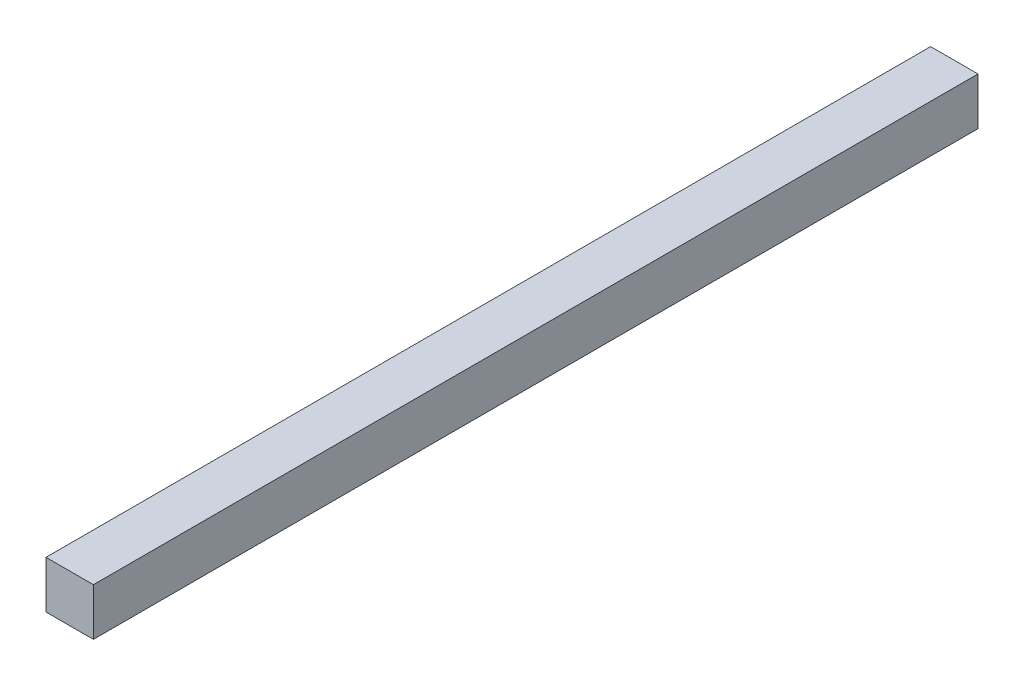
ISO-10303-21;
HEADER;
FILE_DESCRIPTION(('STEP AP214'),'2;1');
FILE_NAME('part.step','',(''),(''),'','','');
FILE_SCHEMA(('AUTOMOTIVE_DESIGN { 1 0 10303 214 1 1 1 1 }'));
ENDSEC;
DATA;
#1=APPLICATION_CONTEXT('core data for automotive mechanical design processes');
#2=APPLICATION_PROTOCOL_DEFINITION('international standard','automotive_design',2000,#1);
#3=PRODUCT_CONTEXT('',#1,'mechanical');
#4=PRODUCT('Part','Part','',(#3));
#5=PRODUCT_RELATED_PRODUCT_CATEGORY('part','',(#4));
#6=PRODUCT_DEFINITION_FORMATION('','',#4);
#7=PRODUCT_DEFINITION_CONTEXT('part definition',#1,'design');
#8=PRODUCT_DEFINITION('design','',#6,#7);
#9=PRODUCT_DEFINITION_SHAPE('','',#8);
#10=(LENGTH_UNIT() NAMED_UNIT(*) SI_UNIT(.MILLI.,.METRE.));
#11=(NAMED_UNIT(*) PLANE_ANGLE_UNIT() SI_UNIT($,.RADIAN.));
#12=(NAMED_UNIT(*) SI_UNIT($,.STERADIAN.) SOLID_ANGLE_UNIT());
#13=UNCERTAINTY_MEASURE_WITH_UNIT(LENGTH_MEASURE(1.E-05),#10,'distance_accuracy_value','');
#14=(GEOMETRIC_REPRESENTATION_CONTEXT(3) GLOBAL_UNCERTAINTY_ASSIGNED_CONTEXT((#13)) GLOBAL_UNIT_ASSIGNED_CONTEXT((#10,
#11,#12)) REPRESENTATION_CONTEXT('',''));
#15=CARTESIAN_POINT('',(0.,0.,0.));
#16=DIRECTION('',(0.,0.,1.));
#17=DIRECTION('',(1.,0.,0.));
#18=AXIS2_PLACEMENT_3D('',#15,#16,#17);
#19=CARTESIAN_POINT('',(15.,15.,560.));
#20=DIRECTION('',(-1.,0.,0.));
#21=DIRECTION('',(0.,-1.,0.));
#22=AXIS2_PLACEMENT_3D('',#19,#20,#21);
#23=PLANE('',#22);
#24=DIRECTION('',(0.,1.,0.));
#25=VECTOR('',#24,1.);
#26=CARTESIAN_POINT('',(15.,15.,0.));
#27=LINE('',#26,#25);
#28=CARTESIAN_POINT('',(15.,-15.,0.));
#29=VERTEX_POINT('',#28);
#30=CARTESIAN_POINT('',(15.,15.,0.));
#31=VERTEX_POINT('',#30);
#32=EDGE_CURVE('E107',#29,#31,#27,.T.);
#33=ORIENTED_EDGE('',*,*,#32,.T.);
#34=DIRECTION('',(0.,0.,-1.));
#35=VECTOR('',#34,1.);
#36=CARTESIAN_POINT('',(15.,15.,560.));
#37=LINE('',#36,#35);
#38=CARTESIAN_POINT('',(15.,15.,560.));
#39=VERTEX_POINT('',#38);
#40=EDGE_CURVE('E11',#39,#31,#37,.T.);
#41=ORIENTED_EDGE('',*,*,#40,.F.);
#42=DIRECTION('',(0.,1.,0.));
#43=VECTOR('',#42,1.);
#44=CARTESIAN_POINT('',(15.,15.,560.));
#45=LINE('',#44,#43);
#46=CARTESIAN_POINT('',(15.,-15.,560.));
#47=VERTEX_POINT('',#46);
#48=EDGE_CURVE('E91',#47,#39,#45,.T.);
#49=ORIENTED_EDGE('',*,*,#48,.F.);
#50=DIRECTION('',(0.,0.,-1.));
#51=VECTOR('',#50,1.);
#52=CARTESIAN_POINT('',(15.,-15.,560.));
#53=LINE('',#52,#51);
#54=EDGE_CURVE('E103',#47,#29,#53,.T.);
#55=ORIENTED_EDGE('',*,*,#54,.T.);
#56=EDGE_LOOP('',(#33,#41,#49,#55));
#57=FACE_BOUND('',#56,.T.);
#58=ADVANCED_FACE('F39',(#57),#23,.F.);
#59=CARTESIAN_POINT('',(-15.,15.,560.));
#60=DIRECTION('',(0.,-1.,0.));
#61=DIRECTION('',(0.,0.,-1.));
#62=AXIS2_PLACEMENT_3D('',#59,#60,#61);
#63=PLANE('',#62);
#64=DIRECTION('',(-1.,0.,0.));
#65=VECTOR('',#64,1.);
#66=CARTESIAN_POINT('',(-15.,15.,0.));
#67=LINE('',#66,#65);
#68=CARTESIAN_POINT('',(-15.,15.,0.));
#69=VERTEX_POINT('',#68);
#70=EDGE_CURVE('E96',#31,#69,#67,.T.);
#71=ORIENTED_EDGE('',*,*,#70,.T.);
#72=DIRECTION('',(0.,0.,-1.));
#73=VECTOR('',#72,1.);
#74=CARTESIAN_POINT('',(-15.,15.,560.));
#75=LINE('',#74,#73);
#76=CARTESIAN_POINT('',(-15.,15.,560.));
#77=VERTEX_POINT('',#76);
#78=EDGE_CURVE('E48',#77,#69,#75,.T.);
#79=ORIENTED_EDGE('',*,*,#78,.F.);
#80=DIRECTION('',(-1.,0.,0.));
#81=VECTOR('',#80,1.);
#82=CARTESIAN_POINT('',(-15.,15.,560.));
#83=LINE('',#82,#81);
#84=EDGE_CURVE('E86',#39,#77,#83,.T.);
#85=ORIENTED_EDGE('',*,*,#84,.F.);
#86=ORIENTED_EDGE('',*,*,#40,.T.);
#87=EDGE_LOOP('',(#71,#79,#85,#86));
#88=FACE_BOUND('',#87,.T.);
#89=ADVANCED_FACE('F95',(#88),#63,.F.);
#90=CARTESIAN_POINT('',(-15.,15.,560.));
#91=DIRECTION('',(1.,0.,0.));
#92=DIRECTION('',(0.,1.,0.));
#93=AXIS2_PLACEMENT_3D('',#90,#91,#92);
#94=PLANE('',#93);
#95=DIRECTION('',(0.,-1.,0.));
#96=VECTOR('',#95,1.);
#97=CARTESIAN_POINT('',(-15.,15.,0.));
#98=LINE('',#97,#96);
#99=CARTESIAN_POINT('',(-15.,-15.,0.));
#100=VERTEX_POINT('',#99);
#101=EDGE_CURVE('E73',#69,#100,#98,.T.);
#102=ORIENTED_EDGE('',*,*,#101,.T.);
#103=DIRECTION('',(0.,0.,-1.));
#104=VECTOR('',#103,1.);
#105=CARTESIAN_POINT('',(-15.,-15.,560.));
#106=LINE('',#105,#104);
#107=CARTESIAN_POINT('',(-15.,-15.,560.));
#108=VERTEX_POINT('',#107);
#109=EDGE_CURVE('E98',#108,#100,#106,.T.);
#110=ORIENTED_EDGE('',*,*,#109,.F.);
#111=DIRECTION('',(0.,-1.,0.));
#112=VECTOR('',#111,1.);
#113=CARTESIAN_POINT('',(-15.,15.,560.));
#114=LINE('',#113,#112);
#115=EDGE_CURVE('E89',#77,#108,#114,.T.);
#116=ORIENTED_EDGE('',*,*,#115,.F.);
#117=ORIENTED_EDGE('',*,*,#78,.T.);
#118=EDGE_LOOP('',(#102,#110,#116,#117));
#119=FACE_BOUND('',#118,.T.);
#120=ADVANCED_FACE('F99',(#119),#94,.F.);
#121=CARTESIAN_POINT('',(-15.,-15.,560.));
#122=DIRECTION('',(0.,1.,0.));
#123=DIRECTION('',(0.,0.,1.));
#124=AXIS2_PLACEMENT_3D('',#121,#122,#123);
#125=PLANE('',#124);
#126=DIRECTION('',(1.,0.,0.));
#127=VECTOR('',#126,1.);
#128=CARTESIAN_POINT('',(-15.,-15.,0.));
#129=LINE('',#128,#127);
#130=EDGE_CURVE('E79',#100,#29,#129,.T.);
#131=ORIENTED_EDGE('',*,*,#130,.T.);
#132=ORIENTED_EDGE('',*,*,#54,.F.);
#133=DIRECTION('',(1.,0.,0.));
#134=VECTOR('',#133,1.);
#135=CARTESIAN_POINT('',(-15.,-15.,560.));
#136=LINE('',#135,#134);
#137=EDGE_CURVE('E56',#108,#47,#136,.T.);
#138=ORIENTED_EDGE('',*,*,#137,.F.);
#139=ORIENTED_EDGE('',*,*,#109,.T.);
#140=EDGE_LOOP('',(#131,#132,#138,#139));
#141=FACE_BOUND('',#140,.T.);
#142=ADVANCED_FACE('F120',(#141),#125,.F.);
#143=CARTESIAN_POINT('',(0.,0.,560.));
#144=DIRECTION('',(0.,0.,1.));
#145=DIRECTION('',(1.,0.,0.));
#146=AXIS2_PLACEMENT_3D('',#143,#144,#145);
#147=PLANE('',#146);
#148=ORIENTED_EDGE('',*,*,#48,.T.);
#149=ORIENTED_EDGE('',*,*,#84,.T.);
#150=ORIENTED_EDGE('',*,*,#115,.T.);
#151=ORIENTED_EDGE('',*,*,#137,.T.);
#152=EDGE_LOOP('',(#148,#149,#150,#151));
#153=FACE_BOUND('',#152,.T.);
#154=ADVANCED_FACE('F87',(#153),#147,.T.);
#155=CARTESIAN_POINT('',(0.,0.,0.));
#156=DIRECTION('',(0.,0.,1.));
#157=DIRECTION('',(1.,0.,0.));
#158=AXIS2_PLACEMENT_3D('',#155,#156,#157);
#159=PLANE('',#158);
#160=ORIENTED_EDGE('',*,*,#32,.F.);
#161=ORIENTED_EDGE('',*,*,#130,.F.);
#162=ORIENTED_EDGE('',*,*,#101,.F.);
#163=ORIENTED_EDGE('',*,*,#70,.F.);
#164=EDGE_LOOP('',(#160,#161,#162,#163));
#165=FACE_BOUND('',#164,.T.);
#166=ADVANCED_FACE('F123',(#165),#159,.F.);
#167=CLOSED_SHELL('',(#58,#89,#120,#142,#154,#166));
#168=MANIFOLD_SOLID_BREP('B2',#167);
#169=ADVANCED_BREP_SHAPE_REPRESENTATION('',(#18,#168),#14);
#170=SHAPE_DEFINITION_REPRESENTATION(#9,#169);
ENDSEC;
END-ISO-10303-21;
